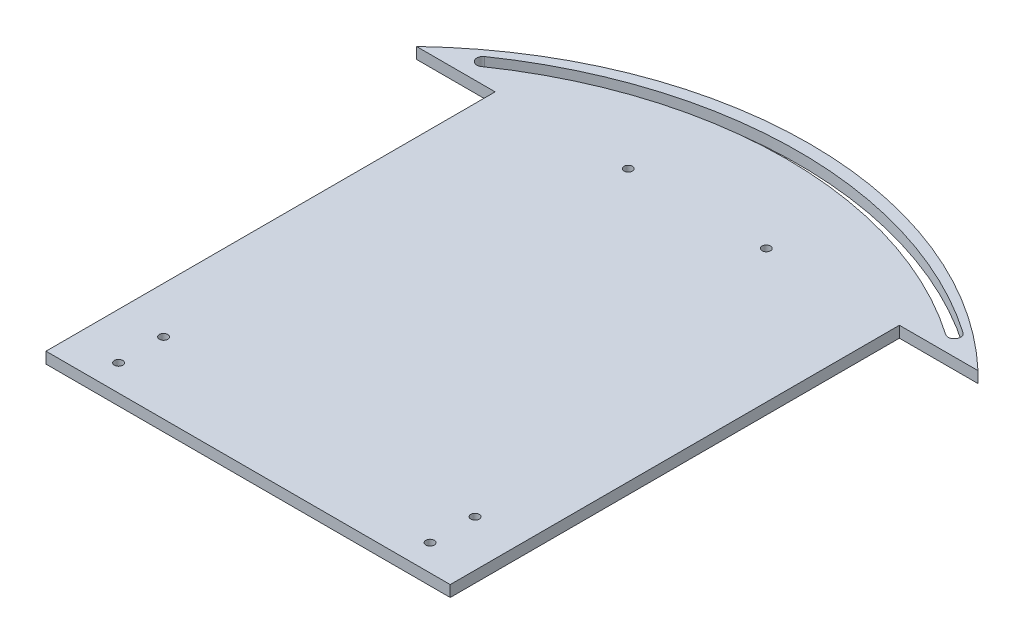
ISO-10303-21;
HEADER;
FILE_DESCRIPTION(('STEP AP214'),'2;1');
FILE_NAME('part.step','',(''),(''),'','','');
FILE_SCHEMA(('AUTOMOTIVE_DESIGN { 1 0 10303 214 1 1 1 1 }'));
ENDSEC;
DATA;
#1=APPLICATION_CONTEXT('core data for automotive mechanical design processes');
#2=APPLICATION_PROTOCOL_DEFINITION('international standard','automotive_design',2000,#1);
#3=PRODUCT_CONTEXT('',#1,'mechanical');
#4=PRODUCT('Part','Part','',(#3));
#5=PRODUCT_RELATED_PRODUCT_CATEGORY('part','',(#4));
#6=PRODUCT_DEFINITION_FORMATION('','',#4);
#7=PRODUCT_DEFINITION_CONTEXT('part definition',#1,'design');
#8=PRODUCT_DEFINITION('design','',#6,#7);
#9=PRODUCT_DEFINITION_SHAPE('','',#8);
#10=(LENGTH_UNIT() NAMED_UNIT(*) SI_UNIT(.MILLI.,.METRE.));
#11=(NAMED_UNIT(*) PLANE_ANGLE_UNIT() SI_UNIT($,.RADIAN.));
#12=(NAMED_UNIT(*) SI_UNIT($,.STERADIAN.) SOLID_ANGLE_UNIT());
#13=UNCERTAINTY_MEASURE_WITH_UNIT(LENGTH_MEASURE(1.E-05),#10,'distance_accuracy_value','');
#14=(GEOMETRIC_REPRESENTATION_CONTEXT(3) GLOBAL_UNCERTAINTY_ASSIGNED_CONTEXT((#13)) GLOBAL_UNIT_ASSIGNED_CONTEXT((#10,
#11,#12)) REPRESENTATION_CONTEXT('',''));
#15=CARTESIAN_POINT('',(0.,0.,0.));
#16=DIRECTION('',(0.,0.,1.));
#17=DIRECTION('',(1.,0.,0.));
#18=AXIS2_PLACEMENT_3D('',#15,#16,#17);
#19=CARTESIAN_POINT('',(100.,4.,105.));
#20=DIRECTION('',(0.,-1.,0.));
#21=DIRECTION('',(0.,0.,-1.));
#22=AXIS2_PLACEMENT_3D('',#19,#20,#21);
#23=PLANE('',#22);
#24=CARTESIAN_POINT('',(124.587604354007,4.,0.));
#25=DIRECTION('',(0.,1.,0.));
#26=DIRECTION('',(0.,0.,-1.));
#27=AXIS2_PLACEMENT_3D('',#24,#25,#26);
#28=CIRCLE('',#27,1.5);
#29=CARTESIAN_POINT('',(124.587604354007,4.,-1.5));
#30=VERTEX_POINT('',#29);
#31=EDGE_CURVE('E165',#30,#30,#28,.T.);
#32=ORIENTED_EDGE('',*,*,#31,.F.);
#33=EDGE_LOOP('',(#32));
#34=FACE_BOUND('',#33,.T.);
#35=CARTESIAN_POINT('',(75.4123956459933,4.,0.));
#36=DIRECTION('',(0.,1.,0.));
#37=DIRECTION('',(0.,0.,1.));
#38=AXIS2_PLACEMENT_3D('',#35,#36,#37);
#39=CIRCLE('',#38,1.5);
#40=CARTESIAN_POINT('',(75.4123956459933,4.,1.5));
#41=VERTEX_POINT('',#40);
#42=EDGE_CURVE('E173',#41,#41,#39,.T.);
#43=ORIENTED_EDGE('',*,*,#42,.F.);
#44=EDGE_LOOP('',(#43));
#45=FACE_BOUND('',#44,.T.);
#46=CARTESIAN_POINT('',(155.480040890749,4.,134.64580803845));
#47=DIRECTION('',(0.,1.,0.));
#48=DIRECTION('',(0.,0.,-1.));
#49=AXIS2_PLACEMENT_3D('',#46,#47,#48);
#50=CIRCLE('',#49,1.5);
#51=CARTESIAN_POINT('',(155.480040890749,4.,133.14580803845));
#52=VERTEX_POINT('',#51);
#53=EDGE_CURVE('E181',#52,#52,#50,.T.);
#54=ORIENTED_EDGE('',*,*,#53,.F.);
#55=EDGE_LOOP('',(#54));
#56=FACE_BOUND('',#55,.T.);
#57=CARTESIAN_POINT('',(155.480040890749,4.,150.668405534525));
#58=DIRECTION('',(0.,1.,0.));
#59=DIRECTION('',(0.,0.,-1.));
#60=AXIS2_PLACEMENT_3D('',#57,#58,#59);
#61=CIRCLE('',#60,1.5);
#62=CARTESIAN_POINT('',(155.480040890749,4.,149.168405534525));
#63=VERTEX_POINT('',#62);
#64=EDGE_CURVE('E189',#63,#63,#61,.T.);
#65=ORIENTED_EDGE('',*,*,#64,.F.);
#66=EDGE_LOOP('',(#65));
#67=FACE_BOUND('',#66,.T.);
#68=CARTESIAN_POINT('',(44.519959109251,4.,134.64580803845));
#69=DIRECTION('',(0.,1.,0.));
#70=DIRECTION('',(0.,0.,1.));
#71=AXIS2_PLACEMENT_3D('',#68,#69,#70);
#72=CIRCLE('',#71,1.5);
#73=CARTESIAN_POINT('',(44.519959109251,4.,136.14580803845));
#74=VERTEX_POINT('',#73);
#75=EDGE_CURVE('E197',#74,#74,#72,.T.);
#76=ORIENTED_EDGE('',*,*,#75,.F.);
#77=EDGE_LOOP('',(#76));
#78=FACE_BOUND('',#77,.T.);
#79=CARTESIAN_POINT('',(44.519959109251,4.,150.668405534525));
#80=DIRECTION('',(0.,1.,0.));
#81=DIRECTION('',(0.,0.,1.));
#82=AXIS2_PLACEMENT_3D('',#79,#80,#81);
#83=CIRCLE('',#82,1.5);
#84=CARTESIAN_POINT('',(44.519959109251,4.,152.168405534525));
#85=VERTEX_POINT('',#84);
#86=EDGE_CURVE('E205',#85,#85,#83,.T.);
#87=ORIENTED_EDGE('',*,*,#86,.F.);
#88=EDGE_LOOP('',(#87));
#89=FACE_BOUND('',#88,.T.);
#90=CARTESIAN_POINT('',(100.,4.,105.));
#91=DIRECTION('',(0.,1.,0.));
#92=DIRECTION('',(0.,0.,-1.));
#93=AXIS2_PLACEMENT_3D('',#90,#91,#92);
#94=CIRCLE('',#93,145.);
#95=CARTESIAN_POINT('',(200.,4.,0.));
#96=VERTEX_POINT('',#95);
#97=CARTESIAN_POINT('',(0.,4.,0.));
#98=VERTEX_POINT('',#97);
#99=EDGE_CURVE('E213',#96,#98,#94,.T.);
#100=ORIENTED_EDGE('',*,*,#99,.T.);
#101=DIRECTION('',(1.,0.,0.));
#102=VECTOR('',#101,1.);
#103=CARTESIAN_POINT('',(0.,4.,0.));
#104=LINE('',#103,#102);
#105=CARTESIAN_POINT('',(28.,4.,0.));
#106=VERTEX_POINT('',#105);
#107=EDGE_CURVE('E217',#98,#106,#104,.T.);
#108=ORIENTED_EDGE('',*,*,#107,.T.);
#109=DIRECTION('',(0.,0.,1.));
#110=VECTOR('',#109,1.);
#111=CARTESIAN_POINT('',(28.,4.,0.));
#112=LINE('',#111,#110);
#113=CARTESIAN_POINT('',(28.,4.,160.));
#114=VERTEX_POINT('',#113);
#115=EDGE_CURVE('E221',#106,#114,#112,.T.);
#116=ORIENTED_EDGE('',*,*,#115,.T.);
#117=DIRECTION('',(1.,0.,0.));
#118=VECTOR('',#117,1.);
#119=CARTESIAN_POINT('',(28.,4.,160.));
#120=LINE('',#119,#118);
#121=CARTESIAN_POINT('',(172.,4.,160.));
#122=VERTEX_POINT('',#121);
#123=EDGE_CURVE('E224',#114,#122,#120,.T.);
#124=ORIENTED_EDGE('',*,*,#123,.T.);
#125=DIRECTION('',(0.,0.,-1.));
#126=VECTOR('',#125,1.);
#127=CARTESIAN_POINT('',(172.,4.,160.));
#128=LINE('',#127,#126);
#129=CARTESIAN_POINT('',(172.,4.,0.));
#130=VERTEX_POINT('',#129);
#131=EDGE_CURVE('E227',#122,#130,#128,.T.);
#132=ORIENTED_EDGE('',*,*,#131,.T.);
#133=DIRECTION('',(1.,0.,0.));
#134=VECTOR('',#133,1.);
#135=CARTESIAN_POINT('',(172.,4.,0.));
#136=LINE('',#135,#134);
#137=EDGE_CURVE('E230',#130,#96,#136,.T.);
#138=ORIENTED_EDGE('',*,*,#137,.T.);
#139=EDGE_LOOP('',(#100,#108,#116,#124,#132,#138));
#140=FACE_BOUND('',#139,.T.);
#141=CARTESIAN_POINT('',(184.391361394653,4.,-7.1977450755081));
#142=DIRECTION('',(0.,1.,0.));
#143=DIRECTION('',(0.,0.,1.));
#144=AXIS2_PLACEMENT_3D('',#141,#142,#143);
#145=CIRCLE('',#144,2.22349586616216);
#146=CARTESIAN_POINT('',(183.125177177182,4.,-5.36998376880839));
#147=VERTEX_POINT('',#146);
#148=CARTESIAN_POINT('',(185.657545612123,4.,-9.02550638220792));
#149=VERTEX_POINT('',#148);
#150=EDGE_CURVE('E117',#147,#149,#145,.T.);
#151=ORIENTED_EDGE('',*,*,#150,.F.);
#152=CARTESIAN_POINT('',(100.44558820107,4.,113.979595462461));
#153=DIRECTION('',(0.,-1.,0.));
#154=DIRECTION('',(0.,0.,1.));
#155=AXIS2_PLACEMENT_3D('',#152,#153,#154);
#156=CIRCLE('',#155,145.190345739446);
#157=CARTESIAN_POINT('',(17.7659992249571,4.,-5.36998376880841));
#158=VERTEX_POINT('',#157);
#159=EDGE_CURVE('E143',#158,#147,#156,.T.);
#160=ORIENTED_EDGE('',*,*,#159,.F.);
#161=CARTESIAN_POINT('',(16.4998150074866,4.,-7.19774507550815));
#162=DIRECTION('',(0.,1.,0.));
#163=DIRECTION('',(0.,0.,1.));
#164=AXIS2_PLACEMENT_3D('',#161,#162,#163);
#165=CIRCLE('',#164,2.22349586616217);
#166=CARTESIAN_POINT('',(15.2336307900161,4.,-9.02550638220793));
#167=VERTEX_POINT('',#166);
#168=EDGE_CURVE('E139',#167,#158,#165,.T.);
#169=ORIENTED_EDGE('',*,*,#168,.F.);
#170=CARTESIAN_POINT('',(100.44558820107,4.,113.979595462461));
#171=DIRECTION('',(0.,1.,0.));
#172=DIRECTION('',(0.,0.,1.));
#173=AXIS2_PLACEMENT_3D('',#170,#171,#172);
#174=CIRCLE('',#173,149.63733747177);
#175=EDGE_CURVE('E126',#149,#167,#174,.T.);
#176=ORIENTED_EDGE('',*,*,#175,.F.);
#177=EDGE_LOOP('',(#151,#160,#169,#176));
#178=FACE_BOUND('',#177,.T.);
#179=ADVANCED_FACE('F39',(#34,#45,#56,#67,#78,#89,#140,#178),#23,.F.);
#180=CARTESIAN_POINT('',(100.,0.,105.));
#181=DIRECTION('',(0.,-1.,0.));
#182=DIRECTION('',(0.,0.,-1.));
#183=AXIS2_PLACEMENT_3D('',#180,#181,#182);
#184=PLANE('',#183);
#185=CARTESIAN_POINT('',(75.4123956459933,0.,0.));
#186=DIRECTION('',(0.,1.,0.));
#187=DIRECTION('',(0.,0.,1.));
#188=AXIS2_PLACEMENT_3D('',#185,#186,#187);
#189=CIRCLE('',#188,1.5);
#190=CARTESIAN_POINT('',(75.4123956459933,0.,1.5));
#191=VERTEX_POINT('',#190);
#192=EDGE_CURVE('E169',#191,#191,#189,.T.);
#193=ORIENTED_EDGE('',*,*,#192,.T.);
#194=EDGE_LOOP('',(#193));
#195=FACE_BOUND('',#194,.T.);
#196=CARTESIAN_POINT('',(155.480040890749,0.,150.668405534525));
#197=DIRECTION('',(0.,1.,0.));
#198=DIRECTION('',(0.,0.,-1.));
#199=AXIS2_PLACEMENT_3D('',#196,#197,#198);
#200=CIRCLE('',#199,1.5);
#201=CARTESIAN_POINT('',(155.480040890749,0.,149.168405534525));
#202=VERTEX_POINT('',#201);
#203=EDGE_CURVE('E185',#202,#202,#200,.T.);
#204=ORIENTED_EDGE('',*,*,#203,.T.);
#205=EDGE_LOOP('',(#204));
#206=FACE_BOUND('',#205,.T.);
#207=CARTESIAN_POINT('',(44.519959109251,0.,150.668405534525));
#208=DIRECTION('',(0.,1.,0.));
#209=DIRECTION('',(0.,0.,1.));
#210=AXIS2_PLACEMENT_3D('',#207,#208,#209);
#211=CIRCLE('',#210,1.5);
#212=CARTESIAN_POINT('',(44.519959109251,0.,152.168405534525));
#213=VERTEX_POINT('',#212);
#214=EDGE_CURVE('E201',#213,#213,#211,.T.);
#215=ORIENTED_EDGE('',*,*,#214,.T.);
#216=EDGE_LOOP('',(#215));
#217=FACE_BOUND('',#216,.T.);
#218=CARTESIAN_POINT('',(100.,0.,105.));
#219=DIRECTION('',(0.,1.,0.));
#220=DIRECTION('',(0.,0.,-1.));
#221=AXIS2_PLACEMENT_3D('',#218,#219,#220);
#222=CIRCLE('',#221,145.);
#223=CARTESIAN_POINT('',(200.,0.,0.));
#224=VERTEX_POINT('',#223);
#225=CARTESIAN_POINT('',(0.,0.,0.));
#226=VERTEX_POINT('',#225);
#227=EDGE_CURVE('E209',#224,#226,#222,.T.);
#228=ORIENTED_EDGE('',*,*,#227,.F.);
#229=DIRECTION('',(1.,0.,0.));
#230=VECTOR('',#229,1.);
#231=CARTESIAN_POINT('',(172.,0.,0.));
#232=LINE('',#231,#230);
#233=CARTESIAN_POINT('',(172.,0.,0.));
#234=VERTEX_POINT('',#233);
#235=EDGE_CURVE('E218',#234,#224,#232,.T.);
#236=ORIENTED_EDGE('',*,*,#235,.F.);
#237=DIRECTION('',(0.,0.,-1.));
#238=VECTOR('',#237,1.);
#239=CARTESIAN_POINT('',(172.,0.,160.));
#240=LINE('',#239,#238);
#241=CARTESIAN_POINT('',(172.,0.,160.));
#242=VERTEX_POINT('',#241);
#243=EDGE_CURVE('E246',#242,#234,#240,.T.);
#244=ORIENTED_EDGE('',*,*,#243,.F.);
#245=DIRECTION('',(1.,0.,0.));
#246=VECTOR('',#245,1.);
#247=CARTESIAN_POINT('',(28.,0.,160.));
#248=LINE('',#247,#246);
#249=CARTESIAN_POINT('',(28.,0.,160.));
#250=VERTEX_POINT('',#249);
#251=EDGE_CURVE('E243',#250,#242,#248,.T.);
#252=ORIENTED_EDGE('',*,*,#251,.F.);
#253=DIRECTION('',(0.,0.,1.));
#254=VECTOR('',#253,1.);
#255=CARTESIAN_POINT('',(28.,0.,0.));
#256=LINE('',#255,#254);
#257=CARTESIAN_POINT('',(28.,0.,0.));
#258=VERTEX_POINT('',#257);
#259=EDGE_CURVE('E240',#258,#250,#256,.T.);
#260=ORIENTED_EDGE('',*,*,#259,.F.);
#261=DIRECTION('',(1.,0.,0.));
#262=VECTOR('',#261,1.);
#263=CARTESIAN_POINT('',(0.,0.,0.));
#264=LINE('',#263,#262);
#265=EDGE_CURVE('E237',#226,#258,#264,.T.);
#266=ORIENTED_EDGE('',*,*,#265,.F.);
#267=EDGE_LOOP('',(#228,#236,#244,#252,#260,#266));
#268=FACE_BOUND('',#267,.T.);
#269=CARTESIAN_POINT('',(44.519959109251,0.,134.64580803845));
#270=DIRECTION('',(0.,1.,0.));
#271=DIRECTION('',(0.,0.,1.));
#272=AXIS2_PLACEMENT_3D('',#269,#270,#271);
#273=CIRCLE('',#272,1.5);
#274=CARTESIAN_POINT('',(44.519959109251,0.,136.14580803845));
#275=VERTEX_POINT('',#274);
#276=EDGE_CURVE('E193',#275,#275,#273,.T.);
#277=ORIENTED_EDGE('',*,*,#276,.T.);
#278=EDGE_LOOP('',(#277));
#279=FACE_BOUND('',#278,.T.);
#280=CARTESIAN_POINT('',(155.480040890749,0.,134.64580803845));
#281=DIRECTION('',(0.,1.,0.));
#282=DIRECTION('',(0.,0.,-1.));
#283=AXIS2_PLACEMENT_3D('',#280,#281,#282);
#284=CIRCLE('',#283,1.5);
#285=CARTESIAN_POINT('',(155.480040890749,0.,133.14580803845));
#286=VERTEX_POINT('',#285);
#287=EDGE_CURVE('E177',#286,#286,#284,.T.);
#288=ORIENTED_EDGE('',*,*,#287,.T.);
#289=EDGE_LOOP('',(#288));
#290=FACE_BOUND('',#289,.T.);
#291=CARTESIAN_POINT('',(124.587604354007,0.,0.));
#292=DIRECTION('',(0.,1.,0.));
#293=DIRECTION('',(0.,0.,-1.));
#294=AXIS2_PLACEMENT_3D('',#291,#292,#293);
#295=CIRCLE('',#294,1.5);
#296=CARTESIAN_POINT('',(124.587604354007,0.,-1.5));
#297=VERTEX_POINT('',#296);
#298=EDGE_CURVE('E135',#297,#297,#295,.T.);
#299=ORIENTED_EDGE('',*,*,#298,.T.);
#300=EDGE_LOOP('',(#299));
#301=FACE_BOUND('',#300,.T.);
#302=CARTESIAN_POINT('',(100.44558820107,0.,113.979595462461));
#303=DIRECTION('',(0.,-1.,0.));
#304=DIRECTION('',(0.,0.,1.));
#305=AXIS2_PLACEMENT_3D('',#302,#303,#304);
#306=CIRCLE('',#305,145.190345739446);
#307=CARTESIAN_POINT('',(17.7659992249571,0.,-5.36998376880838));
#308=VERTEX_POINT('',#307);
#309=CARTESIAN_POINT('',(183.125177177182,0.,-5.36998376880839));
#310=VERTEX_POINT('',#309);
#311=EDGE_CURVE('E127',#308,#310,#306,.T.);
#312=ORIENTED_EDGE('',*,*,#311,.T.);
#313=CARTESIAN_POINT('',(184.391361394653,0.,-7.1977450755081));
#314=DIRECTION('',(0.,1.,0.));
#315=DIRECTION('',(0.,0.,1.));
#316=AXIS2_PLACEMENT_3D('',#313,#314,#315);
#317=CIRCLE('',#316,2.22349586616216);
#318=CARTESIAN_POINT('',(185.657545612123,0.,-9.02550638220792));
#319=VERTEX_POINT('',#318);
#320=EDGE_CURVE('E63',#310,#319,#317,.T.);
#321=ORIENTED_EDGE('',*,*,#320,.T.);
#322=CARTESIAN_POINT('',(100.44558820107,0.,113.979595462461));
#323=DIRECTION('',(0.,1.,0.));
#324=DIRECTION('',(0.,0.,1.));
#325=AXIS2_PLACEMENT_3D('',#322,#323,#324);
#326=CIRCLE('',#325,149.63733747177);
#327=CARTESIAN_POINT('',(15.2336307900161,0.,-9.02550638220793));
#328=VERTEX_POINT('',#327);
#329=EDGE_CURVE('E133',#319,#328,#326,.T.);
#330=ORIENTED_EDGE('',*,*,#329,.T.);
#331=CARTESIAN_POINT('',(16.4998150074866,0.,-7.19774507550815));
#332=DIRECTION('',(0.,1.,0.));
#333=DIRECTION('',(0.,0.,1.));
#334=AXIS2_PLACEMENT_3D('',#331,#332,#333);
#335=CIRCLE('',#334,2.22349586616217);
#336=EDGE_CURVE('E152',#328,#308,#335,.T.);
#337=ORIENTED_EDGE('',*,*,#336,.T.);
#338=EDGE_LOOP('',(#312,#321,#330,#337));
#339=FACE_BOUND('',#338,.T.);
#340=ADVANCED_FACE('F277',(#195,#206,#217,#268,#279,#290,#301,#339),#184,.T.);
#341=CARTESIAN_POINT('',(100.,4.,105.));
#342=DIRECTION('',(0.,-1.,0.));
#343=DIRECTION('',(0.,0.,-1.));
#344=AXIS2_PLACEMENT_3D('',#341,#342,#343);
#345=CYLINDRICAL_SURFACE('',#344,145.);
#346=ORIENTED_EDGE('',*,*,#227,.T.);
#347=DIRECTION('',(0.,-1.,0.));
#348=VECTOR('',#347,1.);
#349=CARTESIAN_POINT('',(0.,4.,0.));
#350=LINE('',#349,#348);
#351=EDGE_CURVE('E11',#98,#226,#350,.T.);
#352=ORIENTED_EDGE('',*,*,#351,.F.);
#353=ORIENTED_EDGE('',*,*,#99,.F.);
#354=DIRECTION('',(0.,-1.,0.));
#355=VECTOR('',#354,1.);
#356=CARTESIAN_POINT('',(200.,4.,0.));
#357=LINE('',#356,#355);
#358=EDGE_CURVE('E233',#96,#224,#357,.T.);
#359=ORIENTED_EDGE('',*,*,#358,.T.);
#360=EDGE_LOOP('',(#346,#352,#353,#359));
#361=FACE_BOUND('',#360,.T.);
#362=ADVANCED_FACE('F41',(#361),#345,.T.);
#363=CARTESIAN_POINT('',(0.,4.,0.));
#364=DIRECTION('',(0.,0.,-1.));
#365=DIRECTION('',(-1.,0.,0.));
#366=AXIS2_PLACEMENT_3D('',#363,#364,#365);
#367=PLANE('',#366);
#368=ORIENTED_EDGE('',*,*,#265,.T.);
#369=DIRECTION('',(0.,-1.,0.));
#370=VECTOR('',#369,1.);
#371=CARTESIAN_POINT('',(28.,4.,0.));
#372=LINE('',#371,#370);
#373=EDGE_CURVE('E48',#106,#258,#372,.T.);
#374=ORIENTED_EDGE('',*,*,#373,.F.);
#375=ORIENTED_EDGE('',*,*,#107,.F.);
#376=ORIENTED_EDGE('',*,*,#351,.T.);
#377=EDGE_LOOP('',(#368,#374,#375,#376));
#378=FACE_BOUND('',#377,.T.);
#379=ADVANCED_FACE('F294',(#378),#367,.F.);
#380=CARTESIAN_POINT('',(28.,4.,0.));
#381=DIRECTION('',(1.,0.,0.));
#382=DIRECTION('',(0.,0.,-1.));
#383=AXIS2_PLACEMENT_3D('',#380,#381,#382);
#384=PLANE('',#383);
#385=ORIENTED_EDGE('',*,*,#259,.T.);
#386=DIRECTION('',(0.,-1.,0.));
#387=VECTOR('',#386,1.);
#388=CARTESIAN_POINT('',(28.,4.,160.));
#389=LINE('',#388,#387);
#390=EDGE_CURVE('E262',#114,#250,#389,.T.);
#391=ORIENTED_EDGE('',*,*,#390,.F.);
#392=ORIENTED_EDGE('',*,*,#115,.F.);
#393=ORIENTED_EDGE('',*,*,#373,.T.);
#394=EDGE_LOOP('',(#385,#391,#392,#393));
#395=FACE_BOUND('',#394,.T.);
#396=ADVANCED_FACE('F271',(#395),#384,.F.);
#397=CARTESIAN_POINT('',(28.,4.,160.));
#398=DIRECTION('',(0.,0.,-1.));
#399=DIRECTION('',(-1.,0.,0.));
#400=AXIS2_PLACEMENT_3D('',#397,#398,#399);
#401=PLANE('',#400);
#402=ORIENTED_EDGE('',*,*,#251,.T.);
#403=DIRECTION('',(0.,-1.,0.));
#404=VECTOR('',#403,1.);
#405=CARTESIAN_POINT('',(172.,4.,160.));
#406=LINE('',#405,#404);
#407=EDGE_CURVE('E258',#122,#242,#406,.T.);
#408=ORIENTED_EDGE('',*,*,#407,.F.);
#409=ORIENTED_EDGE('',*,*,#123,.F.);
#410=ORIENTED_EDGE('',*,*,#390,.T.);
#411=EDGE_LOOP('',(#402,#408,#409,#410));
#412=FACE_BOUND('',#411,.T.);
#413=ADVANCED_FACE('F283',(#412),#401,.F.);
#414=CARTESIAN_POINT('',(172.,4.,160.));
#415=DIRECTION('',(-1.,0.,0.));
#416=DIRECTION('',(0.,0.,1.));
#417=AXIS2_PLACEMENT_3D('',#414,#415,#416);
#418=PLANE('',#417);
#419=ORIENTED_EDGE('',*,*,#243,.T.);
#420=DIRECTION('',(0.,-1.,0.));
#421=VECTOR('',#420,1.);
#422=CARTESIAN_POINT('',(172.,4.,0.));
#423=LINE('',#422,#421);
#424=EDGE_CURVE('E254',#130,#234,#423,.T.);
#425=ORIENTED_EDGE('',*,*,#424,.F.);
#426=ORIENTED_EDGE('',*,*,#131,.F.);
#427=ORIENTED_EDGE('',*,*,#407,.T.);
#428=EDGE_LOOP('',(#419,#425,#426,#427));
#429=FACE_BOUND('',#428,.T.);
#430=ADVANCED_FACE('F287',(#429),#418,.F.);
#431=CARTESIAN_POINT('',(172.,4.,0.));
#432=DIRECTION('',(0.,0.,-1.));
#433=DIRECTION('',(-1.,0.,0.));
#434=AXIS2_PLACEMENT_3D('',#431,#432,#433);
#435=PLANE('',#434);
#436=ORIENTED_EDGE('',*,*,#235,.T.);
#437=ORIENTED_EDGE('',*,*,#358,.F.);
#438=ORIENTED_EDGE('',*,*,#137,.F.);
#439=ORIENTED_EDGE('',*,*,#424,.T.);
#440=EDGE_LOOP('',(#436,#437,#438,#439));
#441=FACE_BOUND('',#440,.T.);
#442=ADVANCED_FACE('F297',(#441),#435,.F.);
#443=CARTESIAN_POINT('',(44.519959109251,4.,150.668405534525));
#444=DIRECTION('',(0.,-1.,0.));
#445=DIRECTION('',(0.,0.,-1.));
#446=AXIS2_PLACEMENT_3D('',#443,#444,#445);
#447=CYLINDRICAL_SURFACE('',#446,1.5);
#448=ORIENTED_EDGE('',*,*,#86,.T.);
#449=EDGE_LOOP('',(#448));
#450=FACE_BOUND('',#449,.T.);
#451=ORIENTED_EDGE('',*,*,#214,.F.);
#452=EDGE_LOOP('',(#451));
#453=FACE_BOUND('',#452,.T.);
#454=ADVANCED_FACE('F299',(#450,#453),#447,.F.);
#455=CARTESIAN_POINT('',(44.519959109251,4.,134.64580803845));
#456=DIRECTION('',(0.,-1.,0.));
#457=DIRECTION('',(0.,0.,-1.));
#458=AXIS2_PLACEMENT_3D('',#455,#456,#457);
#459=CYLINDRICAL_SURFACE('',#458,1.5);
#460=ORIENTED_EDGE('',*,*,#75,.T.);
#461=EDGE_LOOP('',(#460));
#462=FACE_BOUND('',#461,.T.);
#463=ORIENTED_EDGE('',*,*,#276,.F.);
#464=EDGE_LOOP('',(#463));
#465=FACE_BOUND('',#464,.T.);
#466=ADVANCED_FACE('F305',(#462,#465),#459,.F.);
#467=CARTESIAN_POINT('',(155.480040890749,4.,150.668405534525));
#468=DIRECTION('',(0.,-1.,0.));
#469=DIRECTION('',(0.,0.,-1.));
#470=AXIS2_PLACEMENT_3D('',#467,#468,#469);
#471=CYLINDRICAL_SURFACE('',#470,1.5);
#472=ORIENTED_EDGE('',*,*,#64,.T.);
#473=EDGE_LOOP('',(#472));
#474=FACE_BOUND('',#473,.T.);
#475=ORIENTED_EDGE('',*,*,#203,.F.);
#476=EDGE_LOOP('',(#475));
#477=FACE_BOUND('',#476,.T.);
#478=ADVANCED_FACE('F322',(#474,#477),#471,.F.);
#479=CARTESIAN_POINT('',(155.480040890749,4.,134.64580803845));
#480=DIRECTION('',(0.,-1.,0.));
#481=DIRECTION('',(0.,0.,-1.));
#482=AXIS2_PLACEMENT_3D('',#479,#480,#481);
#483=CYLINDRICAL_SURFACE('',#482,1.5);
#484=ORIENTED_EDGE('',*,*,#53,.T.);
#485=EDGE_LOOP('',(#484));
#486=FACE_BOUND('',#485,.T.);
#487=ORIENTED_EDGE('',*,*,#287,.F.);
#488=EDGE_LOOP('',(#487));
#489=FACE_BOUND('',#488,.T.);
#490=ADVANCED_FACE('F326',(#486,#489),#483,.F.);
#491=CARTESIAN_POINT('',(75.4123956459933,4.,0.));
#492=DIRECTION('',(0.,-1.,0.));
#493=DIRECTION('',(0.,0.,-1.));
#494=AXIS2_PLACEMENT_3D('',#491,#492,#493);
#495=CYLINDRICAL_SURFACE('',#494,1.5);
#496=ORIENTED_EDGE('',*,*,#42,.T.);
#497=EDGE_LOOP('',(#496));
#498=FACE_BOUND('',#497,.T.);
#499=ORIENTED_EDGE('',*,*,#192,.F.);
#500=EDGE_LOOP('',(#499));
#501=FACE_BOUND('',#500,.T.);
#502=ADVANCED_FACE('F330',(#498,#501),#495,.F.);
#503=CARTESIAN_POINT('',(124.587604354007,4.,0.));
#504=DIRECTION('',(0.,-1.,0.));
#505=DIRECTION('',(0.,0.,-1.));
#506=AXIS2_PLACEMENT_3D('',#503,#504,#505);
#507=CYLINDRICAL_SURFACE('',#506,1.5);
#508=ORIENTED_EDGE('',*,*,#31,.T.);
#509=EDGE_LOOP('',(#508));
#510=FACE_BOUND('',#509,.T.);
#511=ORIENTED_EDGE('',*,*,#298,.F.);
#512=EDGE_LOOP('',(#511));
#513=FACE_BOUND('',#512,.T.);
#514=ADVANCED_FACE('F334',(#510,#513),#507,.F.);
#515=CARTESIAN_POINT('',(184.391361394653,4.,-7.1977450755081));
#516=DIRECTION('',(0.,-1.,0.));
#517=DIRECTION('',(0.,0.,-1.));
#518=AXIS2_PLACEMENT_3D('',#515,#516,#517);
#519=CYLINDRICAL_SURFACE('',#518,2.22349586616216);
#520=ORIENTED_EDGE('',*,*,#320,.F.);
#521=DIRECTION('',(0.,-1.,0.));
#522=VECTOR('',#521,1.);
#523=CARTESIAN_POINT('',(183.125177177182,4.,-5.36998376880839));
#524=LINE('',#523,#522);
#525=EDGE_CURVE('E121',#147,#310,#524,.T.);
#526=ORIENTED_EDGE('',*,*,#525,.F.);
#527=ORIENTED_EDGE('',*,*,#150,.T.);
#528=DIRECTION('',(0.,-1.,0.));
#529=VECTOR('',#528,1.);
#530=CARTESIAN_POINT('',(185.657545612123,4.,-9.02550638220792));
#531=LINE('',#530,#529);
#532=EDGE_CURVE('E120',#149,#319,#531,.T.);
#533=ORIENTED_EDGE('',*,*,#532,.T.);
#534=EDGE_LOOP('',(#520,#526,#527,#533));
#535=FACE_BOUND('',#534,.T.);
#536=ADVANCED_FACE('F119',(#535),#519,.F.);
#537=CARTESIAN_POINT('',(100.44558820107,4.,113.979595462461));
#538=DIRECTION('',(0.,-1.,0.));
#539=DIRECTION('',(0.,0.,-1.));
#540=AXIS2_PLACEMENT_3D('',#537,#538,#539);
#541=CYLINDRICAL_SURFACE('',#540,149.63733747177);
#542=ORIENTED_EDGE('',*,*,#329,.F.);
#543=ORIENTED_EDGE('',*,*,#532,.F.);
#544=ORIENTED_EDGE('',*,*,#175,.T.);
#545=DIRECTION('',(0.,-1.,0.));
#546=VECTOR('',#545,1.);
#547=CARTESIAN_POINT('',(15.2336307900161,4.,-9.02550638220793));
#548=LINE('',#547,#546);
#549=EDGE_CURVE('E136',#167,#328,#548,.T.);
#550=ORIENTED_EDGE('',*,*,#549,.T.);
#551=EDGE_LOOP('',(#542,#543,#544,#550));
#552=FACE_BOUND('',#551,.T.);
#553=ADVANCED_FACE('F130',(#552),#541,.F.);
#554=CARTESIAN_POINT('',(16.4998150074866,4.,-7.19774507550815));
#555=DIRECTION('',(0.,-1.,0.));
#556=DIRECTION('',(0.,0.,-1.));
#557=AXIS2_PLACEMENT_3D('',#554,#555,#556);
#558=CYLINDRICAL_SURFACE('',#557,2.22349586616217);
#559=ORIENTED_EDGE('',*,*,#336,.F.);
#560=ORIENTED_EDGE('',*,*,#549,.F.);
#561=ORIENTED_EDGE('',*,*,#168,.T.);
#562=DIRECTION('',(0.,-1.,0.));
#563=VECTOR('',#562,1.);
#564=CARTESIAN_POINT('',(17.7659992249571,4.,-5.36998376880838));
#565=LINE('',#564,#563);
#566=EDGE_CURVE('E55',#158,#308,#565,.T.);
#567=ORIENTED_EDGE('',*,*,#566,.T.);
#568=EDGE_LOOP('',(#559,#560,#561,#567));
#569=FACE_BOUND('',#568,.T.);
#570=ADVANCED_FACE('F343',(#569),#558,.F.);
#571=CARTESIAN_POINT('',(100.44558820107,4.,113.979595462461));
#572=DIRECTION('',(0.,-1.,0.));
#573=DIRECTION('',(0.,0.,-1.));
#574=AXIS2_PLACEMENT_3D('',#571,#572,#573);
#575=CYLINDRICAL_SURFACE('',#574,145.190345739446);
#576=ORIENTED_EDGE('',*,*,#311,.F.);
#577=ORIENTED_EDGE('',*,*,#566,.F.);
#578=ORIENTED_EDGE('',*,*,#159,.T.);
#579=ORIENTED_EDGE('',*,*,#525,.T.);
#580=EDGE_LOOP('',(#576,#577,#578,#579));
#581=FACE_BOUND('',#580,.T.);
#582=ADVANCED_FACE('F346',(#581),#575,.T.);
#583=CLOSED_SHELL('',(#179,#340,#362,#379,#396,#413,#430,#442,#454,#466,#478,#490,#502,#514,
#536,#553,#570,#582));
#584=MANIFOLD_SOLID_BREP('B2',#583);
#585=ADVANCED_BREP_SHAPE_REPRESENTATION('',(#18,#584),#14);
#586=SHAPE_DEFINITION_REPRESENTATION(#9,#585);
ENDSEC;
END-ISO-10303-21;
